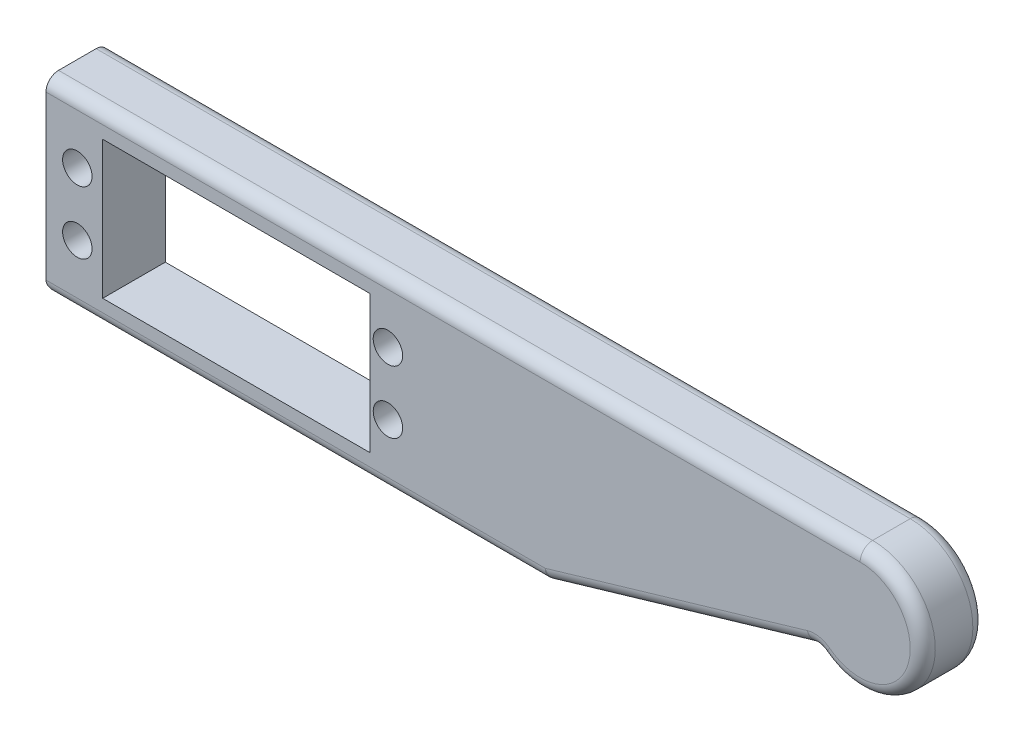
ISO-10303-21;
HEADER;
FILE_DESCRIPTION(('STEP AP214'),'2;1');
FILE_NAME('part.step','',(''),(''),'','','');
FILE_SCHEMA(('AUTOMOTIVE_DESIGN { 1 0 10303 214 1 1 1 1 }'));
ENDSEC;
DATA;
#1=APPLICATION_CONTEXT('core data for automotive mechanical design processes');
#2=APPLICATION_PROTOCOL_DEFINITION('international standard','automotive_design',2000,#1);
#3=PRODUCT_CONTEXT('',#1,'mechanical');
#4=PRODUCT('Part','Part','',(#3));
#5=PRODUCT_RELATED_PRODUCT_CATEGORY('part','',(#4));
#6=PRODUCT_DEFINITION_FORMATION('','',#4);
#7=PRODUCT_DEFINITION_CONTEXT('part definition',#1,'design');
#8=PRODUCT_DEFINITION('design','',#6,#7);
#9=PRODUCT_DEFINITION_SHAPE('','',#8);
#10=(LENGTH_UNIT() NAMED_UNIT(*) SI_UNIT(.MILLI.,.METRE.));
#11=(NAMED_UNIT(*) PLANE_ANGLE_UNIT() SI_UNIT($,.RADIAN.));
#12=(NAMED_UNIT(*) SI_UNIT($,.STERADIAN.) SOLID_ANGLE_UNIT());
#13=UNCERTAINTY_MEASURE_WITH_UNIT(LENGTH_MEASURE(1.E-05),#10,'distance_accuracy_value','');
#14=(GEOMETRIC_REPRESENTATION_CONTEXT(3) GLOBAL_UNCERTAINTY_ASSIGNED_CONTEXT((#13)) GLOBAL_UNIT_ASSIGNED_CONTEXT((#10,
#11,#12)) REPRESENTATION_CONTEXT('',''));
#15=CARTESIAN_POINT('',(0.,0.,0.));
#16=DIRECTION('',(0.,0.,1.));
#17=DIRECTION('',(1.,0.,0.));
#18=AXIS2_PLACEMENT_3D('',#15,#16,#17);
#19=CARTESIAN_POINT('',(60.,5.,10.));
#20=DIRECTION('',(0.,0.,1.));
#21=DIRECTION('',(1.,0.,0.));
#22=AXIS2_PLACEMENT_3D('',#19,#20,#21);
#23=PLANE('',#22);
#24=CARTESIAN_POINT('',(-15.4,-5.00000000000002,10.));
#25=DIRECTION('',(0.,0.,1.));
#26=DIRECTION('',(-1.,0.,0.));
#27=AXIS2_PLACEMENT_3D('',#24,#25,#26);
#28=CIRCLE('',#27,2.35);
#29=CARTESIAN_POINT('',(-17.75,-5.00000000000002,10.));
#30=VERTEX_POINT('',#29);
#31=EDGE_CURVE('E206',#30,#30,#28,.T.);
#32=ORIENTED_EDGE('',*,*,#31,.F.);
#33=EDGE_LOOP('',(#32));
#34=FACE_BOUND('',#33,.T.);
#35=CARTESIAN_POINT('',(-65.,5.00000000000001,10.));
#36=DIRECTION('',(0.,0.,1.));
#37=DIRECTION('',(1.,0.,0.));
#38=AXIS2_PLACEMENT_3D('',#35,#36,#37);
#39=CIRCLE('',#38,2.34999999999999);
#40=CARTESIAN_POINT('',(-62.65,5.00000000000001,10.));
#41=VERTEX_POINT('',#40);
#42=EDGE_CURVE('E217',#41,#41,#39,.T.);
#43=ORIENTED_EDGE('',*,*,#42,.F.);
#44=EDGE_LOOP('',(#43));
#45=FACE_BOUND('',#44,.T.);
#46=CARTESIAN_POINT('',(60.,5.,10.));
#47=DIRECTION('',(0.,0.,1.));
#48=DIRECTION('',(1.,0.,0.));
#49=AXIS2_PLACEMENT_3D('',#46,#47,#48);
#50=CIRCLE('',#49,8.00000000000001);
#51=CARTESIAN_POINT('',(55.1371863446756,-1.35240453321343,10.));
#52=VERTEX_POINT('',#51);
#53=CARTESIAN_POINT('',(60.,13.,10.));
#54=VERTEX_POINT('',#53);
#55=EDGE_CURVE('E244',#52,#54,#50,.T.);
#56=ORIENTED_EDGE('',*,*,#55,.T.);
#57=DIRECTION('',(-1.,0.,0.));
#58=VECTOR('',#57,1.);
#59=CARTESIAN_POINT('',(-70.,13.,10.));
#60=LINE('',#59,#58);
#61=CARTESIAN_POINT('',(-70.,13.,10.));
#62=VERTEX_POINT('',#61);
#63=EDGE_CURVE('E241',#54,#62,#60,.T.);
#64=ORIENTED_EDGE('',*,*,#63,.T.);
#65=DIRECTION('',(0.,-1.,0.));
#66=VECTOR('',#65,1.);
#67=CARTESIAN_POINT('',(-70.,15.,10.));
#68=LINE('',#67,#66);
#69=CARTESIAN_POINT('',(-70.,-13.,10.));
#70=VERTEX_POINT('',#69);
#71=EDGE_CURVE('E221',#62,#70,#68,.T.);
#72=ORIENTED_EDGE('',*,*,#71,.T.);
#73=DIRECTION('',(1.,0.,0.));
#74=VECTOR('',#73,1.);
#75=CARTESIAN_POINT('',(9.99999999999999,-13.,10.));
#76=LINE('',#75,#74);
#77=CARTESIAN_POINT('',(9.71208045693147,-13.,10.));
#78=VERTEX_POINT('',#77);
#79=EDGE_CURVE('E233',#70,#78,#76,.T.);
#80=ORIENTED_EDGE('',*,*,#79,.T.);
#81=DIRECTION('',(0.959392730302152,0.282073729800176,0.));
#82=VECTOR('',#81,1.);
#83=CARTESIAN_POINT('',(52.6085254039965,-0.387896698387758,10.));
#84=LINE('',#83,#82);
#85=CARTESIAN_POINT('',(51.5774845978127,-0.691035878611532,10.));
#86=VERTEX_POINT('',#85);
#87=EDGE_CURVE('E240',#78,#86,#84,.T.);
#88=ORIENTED_EDGE('',*,*,#87,.T.);
#89=CARTESIAN_POINT('',(52.7057795170134,-4.52860679982014,10.));
#90=DIRECTION('',(0.,0.,1.));
#91=DIRECTION('',(1.,0.,0.));
#92=AXIS2_PLACEMENT_3D('',#89,#90,#91);
#93=CIRCLE('',#92,4.);
#94=EDGE_CURVE('E239',#52,#86,#93,.T.);
#95=ORIENTED_EDGE('',*,*,#94,.F.);
#96=EDGE_LOOP('',(#56,#64,#72,#80,#88,#95));
#97=FACE_BOUND('',#96,.T.);
#98=CARTESIAN_POINT('',(-15.4,5.00000000000002,10.));
#99=DIRECTION('',(0.,0.,1.));
#100=DIRECTION('',(1.,0.,0.));
#101=AXIS2_PLACEMENT_3D('',#98,#99,#100);
#102=CIRCLE('',#101,2.35);
#103=CARTESIAN_POINT('',(-13.05,5.00000000000002,10.));
#104=VERTEX_POINT('',#103);
#105=EDGE_CURVE('E215',#104,#104,#102,.T.);
#106=ORIENTED_EDGE('',*,*,#105,.F.);
#107=EDGE_LOOP('',(#106));
#108=FACE_BOUND('',#107,.T.);
#109=CARTESIAN_POINT('',(-65.,-4.99999999999999,10.));
#110=DIRECTION('',(0.,0.,1.));
#111=DIRECTION('',(-1.,0.,0.));
#112=AXIS2_PLACEMENT_3D('',#109,#110,#111);
#113=CIRCLE('',#112,2.34999999999999);
#114=CARTESIAN_POINT('',(-67.35,-4.99999999999999,10.));
#115=VERTEX_POINT('',#114);
#116=EDGE_CURVE('E199',#115,#115,#113,.T.);
#117=ORIENTED_EDGE('',*,*,#116,.F.);
#118=EDGE_LOOP('',(#117));
#119=FACE_BOUND('',#118,.T.);
#120=DIRECTION('',(-1.,0.,0.));
#121=VECTOR('',#120,1.);
#122=CARTESIAN_POINT('',(-60.95,11.,10.));
#123=LINE('',#122,#121);
#124=CARTESIAN_POINT('',(-18.2952994616207,11.,10.));
#125=VERTEX_POINT('',#124);
#126=CARTESIAN_POINT('',(-60.95,11.,10.));
#127=VERTEX_POINT('',#126);
#128=EDGE_CURVE('E60',#125,#127,#123,.T.);
#129=ORIENTED_EDGE('',*,*,#128,.F.);
#130=DIRECTION('',(0.,-1.,0.));
#131=VECTOR('',#130,1.);
#132=CARTESIAN_POINT('',(-18.2952994616207,4.99999999999998,10.));
#133=LINE('',#132,#131);
#134=CARTESIAN_POINT('',(-18.2952994616207,-11.,10.));
#135=VERTEX_POINT('',#134);
#136=EDGE_CURVE('E338',#125,#135,#133,.T.);
#137=ORIENTED_EDGE('',*,*,#136,.T.);
#138=DIRECTION('',(1.,0.,0.));
#139=VECTOR('',#138,1.);
#140=CARTESIAN_POINT('',(-60.95,-11.,10.));
#141=LINE('',#140,#139);
#142=CARTESIAN_POINT('',(-60.95,-11.,10.));
#143=VERTEX_POINT('',#142);
#144=EDGE_CURVE('E61',#143,#135,#141,.T.);
#145=ORIENTED_EDGE('',*,*,#144,.F.);
#146=DIRECTION('',(0.,-1.,0.));
#147=VECTOR('',#146,1.);
#148=CARTESIAN_POINT('',(-60.95,11.,10.));
#149=LINE('',#148,#147);
#150=EDGE_CURVE('E172',#127,#143,#149,.T.);
#151=ORIENTED_EDGE('',*,*,#150,.F.);
#152=EDGE_LOOP('',(#129,#137,#145,#151));
#153=FACE_BOUND('',#152,.T.);
#154=ADVANCED_FACE('F41',(#34,#45,#97,#108,#119,#153),#23,.T.);
#155=CARTESIAN_POINT('',(60.,5.,0.));
#156=DIRECTION('',(0.,0.,1.));
#157=DIRECTION('',(1.,0.,0.));
#158=AXIS2_PLACEMENT_3D('',#155,#156,#157);
#159=PLANE('',#158);
#160=CARTESIAN_POINT('',(-65.,-4.99999999999999,0.));
#161=DIRECTION('',(0.,0.,1.));
#162=DIRECTION('',(-1.,0.,0.));
#163=AXIS2_PLACEMENT_3D('',#160,#161,#162);
#164=CIRCLE('',#163,2.34999999999999);
#165=CARTESIAN_POINT('',(-67.35,-4.99999999999999,0.));
#166=VERTEX_POINT('',#165);
#167=EDGE_CURVE('E200',#166,#166,#164,.T.);
#168=ORIENTED_EDGE('',*,*,#167,.T.);
#169=EDGE_LOOP('',(#168));
#170=FACE_BOUND('',#169,.T.);
#171=CARTESIAN_POINT('',(-15.4,-5.00000000000002,0.));
#172=DIRECTION('',(0.,0.,1.));
#173=DIRECTION('',(-1.,0.,0.));
#174=AXIS2_PLACEMENT_3D('',#171,#172,#173);
#175=CIRCLE('',#174,2.35);
#176=CARTESIAN_POINT('',(-17.75,-5.00000000000002,0.));
#177=VERTEX_POINT('',#176);
#178=EDGE_CURVE('E201',#177,#177,#175,.T.);
#179=ORIENTED_EDGE('',*,*,#178,.T.);
#180=EDGE_LOOP('',(#179));
#181=FACE_BOUND('',#180,.T.);
#182=CARTESIAN_POINT('',(-15.4,5.00000000000002,0.));
#183=DIRECTION('',(0.,0.,1.));
#184=DIRECTION('',(1.,0.,0.));
#185=AXIS2_PLACEMENT_3D('',#182,#183,#184);
#186=CIRCLE('',#185,2.35);
#187=CARTESIAN_POINT('',(-13.05,5.00000000000002,0.));
#188=VERTEX_POINT('',#187);
#189=EDGE_CURVE('E207',#188,#188,#186,.T.);
#190=ORIENTED_EDGE('',*,*,#189,.T.);
#191=EDGE_LOOP('',(#190));
#192=FACE_BOUND('',#191,.T.);
#193=CARTESIAN_POINT('',(-65.,5.00000000000001,0.));
#194=DIRECTION('',(0.,0.,1.));
#195=DIRECTION('',(1.,0.,0.));
#196=AXIS2_PLACEMENT_3D('',#193,#194,#195);
#197=CIRCLE('',#196,2.34999999999999);
#198=CARTESIAN_POINT('',(-62.65,5.00000000000001,0.));
#199=VERTEX_POINT('',#198);
#200=EDGE_CURVE('E214',#199,#199,#197,.T.);
#201=ORIENTED_EDGE('',*,*,#200,.T.);
#202=EDGE_LOOP('',(#201));
#203=FACE_BOUND('',#202,.T.);
#204=DIRECTION('',(0.,-1.,0.));
#205=VECTOR('',#204,1.);
#206=CARTESIAN_POINT('',(-70.,15.,0.));
#207=LINE('',#206,#205);
#208=CARTESIAN_POINT('',(-70.,13.,0.));
#209=VERTEX_POINT('',#208);
#210=CARTESIAN_POINT('',(-70.,-13.,0.));
#211=VERTEX_POINT('',#210);
#212=EDGE_CURVE('E222',#209,#211,#207,.T.);
#213=ORIENTED_EDGE('',*,*,#212,.F.);
#214=DIRECTION('',(-1.,0.,0.));
#215=VECTOR('',#214,1.);
#216=CARTESIAN_POINT('',(60.,13.,0.));
#217=LINE('',#216,#215);
#218=CARTESIAN_POINT('',(60.,13.,0.));
#219=VERTEX_POINT('',#218);
#220=EDGE_CURVE('E266',#209,#219,#217,.F.);
#221=ORIENTED_EDGE('',*,*,#220,.T.);
#222=CARTESIAN_POINT('',(60.,5.,0.));
#223=DIRECTION('',(0.,0.,1.));
#224=DIRECTION('',(1.,0.,0.));
#225=AXIS2_PLACEMENT_3D('',#222,#223,#224);
#226=CIRCLE('',#225,8.00000000000001);
#227=CARTESIAN_POINT('',(55.1371863446756,-1.35240453321343,0.));
#228=VERTEX_POINT('',#227);
#229=EDGE_CURVE('E262',#219,#228,#226,.F.);
#230=ORIENTED_EDGE('',*,*,#229,.T.);
#231=CARTESIAN_POINT('',(52.7057795170134,-4.52860679982014,0.));
#232=DIRECTION('',(0.,0.,1.));
#233=DIRECTION('',(1.,0.,0.));
#234=AXIS2_PLACEMENT_3D('',#231,#232,#233);
#235=CIRCLE('',#234,4.);
#236=CARTESIAN_POINT('',(51.5774845978127,-0.691035878611534,0.));
#237=VERTEX_POINT('',#236);
#238=EDGE_CURVE('E261',#237,#228,#235,.F.);
#239=ORIENTED_EDGE('',*,*,#238,.F.);
#240=DIRECTION('',(0.959392730302152,0.282073729800176,0.));
#241=VECTOR('',#240,1.);
#242=CARTESIAN_POINT('',(60.8699628038205,2.0410715304471,0.));
#243=LINE('',#242,#241);
#244=CARTESIAN_POINT('',(9.71208045693148,-13.,0.));
#245=VERTEX_POINT('',#244);
#246=EDGE_CURVE('E259',#237,#245,#243,.F.);
#247=ORIENTED_EDGE('',*,*,#246,.T.);
#248=DIRECTION('',(1.,0.,0.));
#249=VECTOR('',#248,1.);
#250=CARTESIAN_POINT('',(60.,-13.,0.));
#251=LINE('',#250,#249);
#252=EDGE_CURVE('E260',#245,#211,#251,.F.);
#253=ORIENTED_EDGE('',*,*,#252,.T.);
#254=EDGE_LOOP('',(#213,#221,#230,#239,#247,#253));
#255=FACE_BOUND('',#254,.T.);
#256=DIRECTION('',(0.,1.,0.));
#257=VECTOR('',#256,1.);
#258=CARTESIAN_POINT('',(-19.45,11.,0.));
#259=LINE('',#258,#257);
#260=CARTESIAN_POINT('',(-19.45,-11.,0.));
#261=VERTEX_POINT('',#260);
#262=CARTESIAN_POINT('',(-19.45,11.,0.));
#263=VERTEX_POINT('',#262);
#264=EDGE_CURVE('E189',#261,#263,#259,.T.);
#265=ORIENTED_EDGE('',*,*,#264,.T.);
#266=DIRECTION('',(-1.,0.,0.));
#267=VECTOR('',#266,1.);
#268=CARTESIAN_POINT('',(-60.95,11.,0.));
#269=LINE('',#268,#267);
#270=CARTESIAN_POINT('',(-60.95,11.,0.));
#271=VERTEX_POINT('',#270);
#272=EDGE_CURVE('E188',#263,#271,#269,.T.);
#273=ORIENTED_EDGE('',*,*,#272,.T.);
#274=DIRECTION('',(0.,-1.,0.));
#275=VECTOR('',#274,1.);
#276=CARTESIAN_POINT('',(-60.95,11.,0.));
#277=LINE('',#276,#275);
#278=CARTESIAN_POINT('',(-60.95,-11.,0.));
#279=VERTEX_POINT('',#278);
#280=EDGE_CURVE('E180',#271,#279,#277,.T.);
#281=ORIENTED_EDGE('',*,*,#280,.T.);
#282=DIRECTION('',(1.,0.,0.));
#283=VECTOR('',#282,1.);
#284=CARTESIAN_POINT('',(-60.95,-11.,0.));
#285=LINE('',#284,#283);
#286=EDGE_CURVE('E174',#279,#261,#285,.T.);
#287=ORIENTED_EDGE('',*,*,#286,.T.);
#288=EDGE_LOOP('',(#265,#273,#281,#287));
#289=FACE_BOUND('',#288,.T.);
#290=ADVANCED_FACE('F352',(#170,#181,#192,#203,#255,#289),#159,.F.);
#291=CARTESIAN_POINT('',(-70.,15.,10.));
#292=DIRECTION('',(1.,0.,0.));
#293=DIRECTION('',(0.,0.,-1.));
#294=AXIS2_PLACEMENT_3D('',#291,#292,#293);
#295=PLANE('',#294);
#296=ORIENTED_EDGE('',*,*,#71,.F.);
#297=CARTESIAN_POINT('',(-70.,13.,8.));
#298=DIRECTION('',(1.,0.,0.));
#299=DIRECTION('',(0.,0.,-1.));
#300=AXIS2_PLACEMENT_3D('',#297,#298,#299);
#301=CIRCLE('',#300,2.);
#302=CARTESIAN_POINT('',(-70.,15.,8.));
#303=VERTEX_POINT('',#302);
#304=EDGE_CURVE('E253',#62,#303,#301,.F.);
#305=ORIENTED_EDGE('',*,*,#304,.T.);
#306=DIRECTION('',(0.,0.,-1.));
#307=VECTOR('',#306,1.);
#308=CARTESIAN_POINT('',(-70.,15.,10.));
#309=LINE('',#308,#307);
#310=CARTESIAN_POINT('',(-70.,15.,2.));
#311=VERTEX_POINT('',#310);
#312=EDGE_CURVE('E229',#303,#311,#309,.T.);
#313=ORIENTED_EDGE('',*,*,#312,.T.);
#314=CARTESIAN_POINT('',(-70.,13.,2.));
#315=DIRECTION('',(1.,0.,0.));
#316=DIRECTION('',(0.,0.,-1.));
#317=AXIS2_PLACEMENT_3D('',#314,#315,#316);
#318=CIRCLE('',#317,2.);
#319=EDGE_CURVE('E246',#311,#209,#318,.F.);
#320=ORIENTED_EDGE('',*,*,#319,.T.);
#321=ORIENTED_EDGE('',*,*,#212,.T.);
#322=DIRECTION('',(0.,0.,-1.));
#323=VECTOR('',#322,1.);
#324=CARTESIAN_POINT('',(-70.,-13.,10.));
#325=LINE('',#324,#323);
#326=EDGE_CURVE('E249',#211,#70,#325,.F.);
#327=ORIENTED_EDGE('',*,*,#326,.T.);
#328=EDGE_LOOP('',(#296,#305,#313,#320,#321,#327));
#329=FACE_BOUND('',#328,.T.);
#330=ADVANCED_FACE('F355',(#329),#295,.F.);
#331=CARTESIAN_POINT('',(-70.,-15.,10.));
#332=DIRECTION('',(0.,1.,0.));
#333=DIRECTION('',(0.,0.,1.));
#334=AXIS2_PLACEMENT_3D('',#331,#332,#333);
#335=PLANE('',#334);
#336=DIRECTION('',(1.,0.,0.));
#337=VECTOR('',#336,1.);
#338=CARTESIAN_POINT('',(-70.,-15.,8.));
#339=LINE('',#338,#337);
#340=CARTESIAN_POINT('',(9.71208045693148,-15.,8.));
#341=VERTEX_POINT('',#340);
#342=CARTESIAN_POINT('',(-68.,-15.,8.));
#343=VERTEX_POINT('',#342);
#344=EDGE_CURVE('E289',#341,#343,#339,.F.);
#345=ORIENTED_EDGE('',*,*,#344,.T.);
#346=DIRECTION('',(0.,0.,-1.));
#347=VECTOR('',#346,1.);
#348=CARTESIAN_POINT('',(-68.,-15.,10.));
#349=LINE('',#348,#347);
#350=CARTESIAN_POINT('',(-68.,-15.,2.));
#351=VERTEX_POINT('',#350);
#352=EDGE_CURVE('E286',#343,#351,#349,.T.);
#353=ORIENTED_EDGE('',*,*,#352,.T.);
#354=DIRECTION('',(1.,0.,0.));
#355=VECTOR('',#354,1.);
#356=CARTESIAN_POINT('',(-70.,-15.,2.));
#357=LINE('',#356,#355);
#358=CARTESIAN_POINT('',(9.71208045693148,-15.,2.));
#359=VERTEX_POINT('',#358);
#360=EDGE_CURVE('E285',#351,#359,#357,.T.);
#361=ORIENTED_EDGE('',*,*,#360,.T.);
#362=DIRECTION('',(0.,0.,-1.));
#363=VECTOR('',#362,1.);
#364=CARTESIAN_POINT('',(9.71208045693148,-15.,10.));
#365=LINE('',#364,#363);
#366=EDGE_CURVE('E283',#359,#341,#365,.F.);
#367=ORIENTED_EDGE('',*,*,#366,.T.);
#368=EDGE_LOOP('',(#345,#353,#361,#367));
#369=FACE_BOUND('',#368,.T.);
#370=ADVANCED_FACE('F358',(#369),#335,.F.);
#371=CARTESIAN_POINT('',(9.99999999999999,-15.,10.));
#372=DIRECTION('',(-0.282073729800176,0.959392730302152,0.));
#373=DIRECTION('',(-0.959392730302152,-0.282073729800176,0.));
#374=AXIS2_PLACEMENT_3D('',#371,#372,#373);
#375=PLANE('',#374);
#376=DIRECTION('',(0.,0.,1.));
#377=VECTOR('',#376,1.);
#378=CARTESIAN_POINT('',(52.141632057413,-2.60982133921584,10.));
#379=LINE('',#378,#377);
#380=CARTESIAN_POINT('',(52.141632057413,-2.60982133921584,2.));
#381=VERTEX_POINT('',#380);
#382=CARTESIAN_POINT('',(52.141632057413,-2.60982133921584,8.));
#383=VERTEX_POINT('',#382);
#384=EDGE_CURVE('E279',#381,#383,#379,.T.);
#385=ORIENTED_EDGE('',*,*,#384,.T.);
#386=DIRECTION('',(0.959392730302152,0.282073729800176,0.));
#387=VECTOR('',#386,1.);
#388=CARTESIAN_POINT('',(9.99999999999999,-15.,8.));
#389=LINE('',#388,#387);
#390=CARTESIAN_POINT('',(10.2762279165318,-14.9187854606043,8.));
#391=VERTEX_POINT('',#390);
#392=EDGE_CURVE('E278',#383,#391,#389,.F.);
#393=ORIENTED_EDGE('',*,*,#392,.T.);
#394=DIRECTION('',(0.,0.,-1.));
#395=VECTOR('',#394,1.);
#396=CARTESIAN_POINT('',(10.2762279165318,-14.9187854606043,10.));
#397=LINE('',#396,#395);
#398=CARTESIAN_POINT('',(10.2762279165318,-14.9187854606043,2.));
#399=VERTEX_POINT('',#398);
#400=EDGE_CURVE('E273',#391,#399,#397,.T.);
#401=ORIENTED_EDGE('',*,*,#400,.T.);
#402=DIRECTION('',(0.959392730302152,0.282073729800176,0.));
#403=VECTOR('',#402,1.);
#404=CARTESIAN_POINT('',(9.99999999999999,-15.,2.));
#405=LINE('',#404,#403);
#406=EDGE_CURVE('E277',#399,#381,#405,.T.);
#407=ORIENTED_EDGE('',*,*,#406,.T.);
#408=EDGE_LOOP('',(#385,#393,#401,#407));
#409=FACE_BOUND('',#408,.T.);
#410=ADVANCED_FACE('F380',(#409),#375,.F.);
#411=CARTESIAN_POINT('',(60.,5.,10.));
#412=DIRECTION('',(0.,0.,-1.));
#413=DIRECTION('',(-1.,0.,0.));
#414=AXIS2_PLACEMENT_3D('',#411,#412,#413);
#415=CYLINDRICAL_SURFACE('',#414,10.);
#416=DIRECTION('',(0.,0.,-1.));
#417=VECTOR('',#416,1.);
#418=CARTESIAN_POINT('',(60.,15.,10.));
#419=LINE('',#418,#417);
#420=CARTESIAN_POINT('',(60.,15.,8.));
#421=VERTEX_POINT('',#420);
#422=CARTESIAN_POINT('',(60.,15.,2.));
#423=VERTEX_POINT('',#422);
#424=EDGE_CURVE('E234',#421,#423,#419,.T.);
#425=ORIENTED_EDGE('',*,*,#424,.F.);
#426=CARTESIAN_POINT('',(60.,5.,8.));
#427=DIRECTION('',(0.,0.,1.));
#428=DIRECTION('',(1.,0.,0.));
#429=AXIS2_PLACEMENT_3D('',#426,#427,#428);
#430=CIRCLE('',#429,10.);
#431=CARTESIAN_POINT('',(53.9214829308445,-2.94050566651679,8.));
#432=VERTEX_POINT('',#431);
#433=EDGE_CURVE('E275',#421,#432,#430,.F.);
#434=ORIENTED_EDGE('',*,*,#433,.T.);
#435=DIRECTION('',(0.,0.,-1.));
#436=VECTOR('',#435,1.);
#437=CARTESIAN_POINT('',(53.9214829308445,-2.94050566651679,10.));
#438=LINE('',#437,#436);
#439=CARTESIAN_POINT('',(53.9214829308445,-2.94050566651679,2.));
#440=VERTEX_POINT('',#439);
#441=EDGE_CURVE('E268',#432,#440,#438,.T.);
#442=ORIENTED_EDGE('',*,*,#441,.T.);
#443=CARTESIAN_POINT('',(60.,5.,2.));
#444=DIRECTION('',(0.,0.,1.));
#445=DIRECTION('',(1.,0.,0.));
#446=AXIS2_PLACEMENT_3D('',#443,#444,#445);
#447=CIRCLE('',#446,10.);
#448=EDGE_CURVE('E269',#440,#423,#447,.T.);
#449=ORIENTED_EDGE('',*,*,#448,.T.);
#450=EDGE_LOOP('',(#425,#434,#442,#449));
#451=FACE_BOUND('',#450,.T.);
#452=ADVANCED_FACE('F373',(#451),#415,.T.);
#453=CARTESIAN_POINT('',(-70.,15.,10.));
#454=DIRECTION('',(0.,-1.,0.));
#455=DIRECTION('',(1.,0.,0.));
#456=AXIS2_PLACEMENT_3D('',#453,#454,#455);
#457=PLANE('',#456);
#458=ORIENTED_EDGE('',*,*,#312,.F.);
#459=DIRECTION('',(-1.,0.,0.));
#460=VECTOR('',#459,1.);
#461=CARTESIAN_POINT('',(60.,15.,8.));
#462=LINE('',#461,#460);
#463=EDGE_CURVE('E254',#303,#421,#462,.F.);
#464=ORIENTED_EDGE('',*,*,#463,.T.);
#465=ORIENTED_EDGE('',*,*,#424,.T.);
#466=DIRECTION('',(-1.,0.,0.));
#467=VECTOR('',#466,1.);
#468=CARTESIAN_POINT('',(-70.,15.,2.));
#469=LINE('',#468,#467);
#470=EDGE_CURVE('E251',#423,#311,#469,.T.);
#471=ORIENTED_EDGE('',*,*,#470,.T.);
#472=EDGE_LOOP('',(#458,#464,#465,#471));
#473=FACE_BOUND('',#472,.T.);
#474=ADVANCED_FACE('F369',(#473),#457,.F.);
#475=CARTESIAN_POINT('',(-65.,5.00000000000001,10.));
#476=DIRECTION('',(0.,0.,-1.));
#477=DIRECTION('',(-1.,0.,0.));
#478=AXIS2_PLACEMENT_3D('',#475,#476,#477);
#479=CYLINDRICAL_SURFACE('',#478,2.34999999999999);
#480=ORIENTED_EDGE('',*,*,#42,.T.);
#481=EDGE_LOOP('',(#480));
#482=FACE_BOUND('',#481,.T.);
#483=ORIENTED_EDGE('',*,*,#200,.F.);
#484=EDGE_LOOP('',(#483));
#485=FACE_BOUND('',#484,.T.);
#486=ADVANCED_FACE('F375',(#482,#485),#479,.F.);
#487=CARTESIAN_POINT('',(-15.4,5.00000000000002,10.));
#488=DIRECTION('',(0.,0.,-1.));
#489=DIRECTION('',(-1.,0.,0.));
#490=AXIS2_PLACEMENT_3D('',#487,#488,#489);
#491=CYLINDRICAL_SURFACE('',#490,2.35);
#492=ORIENTED_EDGE('',*,*,#105,.T.);
#493=EDGE_LOOP('',(#492));
#494=FACE_BOUND('',#493,.T.);
#495=ORIENTED_EDGE('',*,*,#189,.F.);
#496=EDGE_LOOP('',(#495));
#497=FACE_BOUND('',#496,.T.);
#498=ADVANCED_FACE('F510',(#494,#497),#491,.F.);
#499=CARTESIAN_POINT('',(-15.4,-5.00000000000002,10.));
#500=DIRECTION('',(0.,0.,-1.));
#501=DIRECTION('',(-1.,0.,0.));
#502=AXIS2_PLACEMENT_3D('',#499,#500,#501);
#503=CYLINDRICAL_SURFACE('',#502,2.35);
#504=ORIENTED_EDGE('',*,*,#31,.T.);
#505=EDGE_LOOP('',(#504));
#506=FACE_BOUND('',#505,.T.);
#507=ORIENTED_EDGE('',*,*,#178,.F.);
#508=EDGE_LOOP('',(#507));
#509=FACE_BOUND('',#508,.T.);
#510=ADVANCED_FACE('F498',(#506,#509),#503,.F.);
#511=CARTESIAN_POINT('',(-65.,-4.99999999999999,10.));
#512=DIRECTION('',(0.,0.,-1.));
#513=DIRECTION('',(-1.,0.,0.));
#514=AXIS2_PLACEMENT_3D('',#511,#512,#513);
#515=CYLINDRICAL_SURFACE('',#514,2.34999999999999);
#516=ORIENTED_EDGE('',*,*,#116,.T.);
#517=EDGE_LOOP('',(#516));
#518=FACE_BOUND('',#517,.T.);
#519=ORIENTED_EDGE('',*,*,#167,.F.);
#520=EDGE_LOOP('',(#519));
#521=FACE_BOUND('',#520,.T.);
#522=ADVANCED_FACE('F500',(#518,#521),#515,.F.);
#523=CARTESIAN_POINT('',(-19.45,11.,10.));
#524=DIRECTION('',(-1.,0.,0.));
#525=DIRECTION('',(0.,-1.,0.));
#526=AXIS2_PLACEMENT_3D('',#523,#524,#525);
#527=PLANE('',#526);
#528=DIRECTION('',(0.,0.,-1.));
#529=VECTOR('',#528,1.);
#530=CARTESIAN_POINT('',(-19.45,-11.,10.));
#531=LINE('',#530,#529);
#532=CARTESIAN_POINT('',(-19.45,-11.,7.99999999999998));
#533=VERTEX_POINT('',#532);
#534=EDGE_CURVE('E184',#533,#261,#531,.T.);
#535=ORIENTED_EDGE('',*,*,#534,.F.);
#536=DIRECTION('',(0.,1.,0.));
#537=VECTOR('',#536,1.);
#538=CARTESIAN_POINT('',(-19.45,11.,7.99999999999998));
#539=LINE('',#538,#537);
#540=CARTESIAN_POINT('',(-19.45,11.,7.99999999999998));
#541=VERTEX_POINT('',#540);
#542=EDGE_CURVE('E295',#533,#541,#539,.T.);
#543=ORIENTED_EDGE('',*,*,#542,.T.);
#544=DIRECTION('',(0.,0.,-1.));
#545=VECTOR('',#544,1.);
#546=CARTESIAN_POINT('',(-19.45,11.,10.));
#547=LINE('',#546,#545);
#548=EDGE_CURVE('E178',#541,#263,#547,.T.);
#549=ORIENTED_EDGE('',*,*,#548,.T.);
#550=ORIENTED_EDGE('',*,*,#264,.F.);
#551=EDGE_LOOP('',(#535,#543,#549,#550));
#552=FACE_BOUND('',#551,.T.);
#553=ADVANCED_FACE('F349',(#552),#527,.T.);
#554=CARTESIAN_POINT('',(-60.95,11.,10.));
#555=DIRECTION('',(0.,-1.,0.));
#556=DIRECTION('',(0.,0.,-1.));
#557=AXIS2_PLACEMENT_3D('',#554,#555,#556);
#558=PLANE('',#557);
#559=ORIENTED_EDGE('',*,*,#272,.F.);
#560=ORIENTED_EDGE('',*,*,#548,.F.);
#561=DIRECTION('',(-0.499999999999998,0.,-0.86602540378444));
#562=VECTOR('',#561,1.);
#563=CARTESIAN_POINT('',(-19.45,11.,7.99999999999998));
#564=LINE('',#563,#562);
#565=EDGE_CURVE('E49',#541,#125,#564,.F.);
#566=ORIENTED_EDGE('',*,*,#565,.T.);
#567=ORIENTED_EDGE('',*,*,#128,.T.);
#568=DIRECTION('',(0.,0.,-1.));
#569=VECTOR('',#568,1.);
#570=CARTESIAN_POINT('',(-60.95,11.,10.));
#571=LINE('',#570,#569);
#572=EDGE_CURVE('E170',#127,#271,#571,.T.);
#573=ORIENTED_EDGE('',*,*,#572,.T.);
#574=EDGE_LOOP('',(#559,#560,#566,#567,#573));
#575=FACE_BOUND('',#574,.T.);
#576=ADVANCED_FACE('F167',(#575),#558,.T.);
#577=CARTESIAN_POINT('',(-60.95,11.,10.));
#578=DIRECTION('',(1.,0.,0.));
#579=DIRECTION('',(0.,1.,0.));
#580=AXIS2_PLACEMENT_3D('',#577,#578,#579);
#581=PLANE('',#580);
#582=ORIENTED_EDGE('',*,*,#280,.F.);
#583=ORIENTED_EDGE('',*,*,#572,.F.);
#584=ORIENTED_EDGE('',*,*,#150,.T.);
#585=DIRECTION('',(0.,0.,-1.));
#586=VECTOR('',#585,1.);
#587=CARTESIAN_POINT('',(-60.95,-11.,10.));
#588=LINE('',#587,#586);
#589=EDGE_CURVE('E182',#143,#279,#588,.T.);
#590=ORIENTED_EDGE('',*,*,#589,.T.);
#591=EDGE_LOOP('',(#582,#583,#584,#590));
#592=FACE_BOUND('',#591,.T.);
#593=ADVANCED_FACE('F177',(#592),#581,.T.);
#594=CARTESIAN_POINT('',(-60.95,-11.,10.));
#595=DIRECTION('',(0.,1.,0.));
#596=DIRECTION('',(0.,0.,1.));
#597=AXIS2_PLACEMENT_3D('',#594,#595,#596);
#598=PLANE('',#597);
#599=ORIENTED_EDGE('',*,*,#286,.F.);
#600=ORIENTED_EDGE('',*,*,#589,.F.);
#601=ORIENTED_EDGE('',*,*,#144,.T.);
#602=DIRECTION('',(0.499999999999998,0.,0.86602540378444));
#603=VECTOR('',#602,1.);
#604=CARTESIAN_POINT('',(-19.45,-11.,7.99999999999998));
#605=LINE('',#604,#603);
#606=EDGE_CURVE('E11',#135,#533,#605,.F.);
#607=ORIENTED_EDGE('',*,*,#606,.T.);
#608=ORIENTED_EDGE('',*,*,#534,.T.);
#609=EDGE_LOOP('',(#599,#600,#601,#607,#608));
#610=FACE_BOUND('',#609,.T.);
#611=ADVANCED_FACE('F347',(#610),#598,.T.);
#612=CARTESIAN_POINT('',(-70.,-13.,2.));
#613=DIRECTION('',(1.,0.,0.));
#614=DIRECTION('',(0.,0.,-1.));
#615=AXIS2_PLACEMENT_3D('',#612,#613,#614);
#616=CYLINDRICAL_SURFACE('',#615,2.);
#617=CARTESIAN_POINT('',(-68.,-13.,2.));
#618=DIRECTION('',(0.707106781186547,0.,-0.707106781186547));
#619=DIRECTION('',(0.707106781186547,0.,0.707106781186547));
#620=AXIS2_PLACEMENT_3D('',#617,#618,#619);
#621=ELLIPSE('',#620,2.82842712474619,2.);
#622=EDGE_CURVE('E331',#211,#351,#621,.F.);
#623=ORIENTED_EDGE('',*,*,#622,.F.);
#624=ORIENTED_EDGE('',*,*,#252,.F.);
#625=CARTESIAN_POINT('',(9.71208045693148,-13.,2.));
#626=DIRECTION('',(1.,0.,0.));
#627=DIRECTION('',(0.,0.,-1.));
#628=AXIS2_PLACEMENT_3D('',#625,#626,#627);
#629=CIRCLE('',#628,2.);
#630=EDGE_CURVE('E192',#359,#245,#629,.T.);
#631=ORIENTED_EDGE('',*,*,#630,.F.);
#632=ORIENTED_EDGE('',*,*,#360,.F.);
#633=EDGE_LOOP('',(#623,#624,#631,#632));
#634=FACE_BOUND('',#633,.T.);
#635=ADVANCED_FACE('F438',(#634),#616,.T.);
#636=CARTESIAN_POINT('',(-70.,13.,2.));
#637=DIRECTION('',(-1.,0.,0.));
#638=DIRECTION('',(0.,-1.,0.));
#639=AXIS2_PLACEMENT_3D('',#636,#637,#638);
#640=CYLINDRICAL_SURFACE('',#639,2.);
#641=ORIENTED_EDGE('',*,*,#319,.F.);
#642=ORIENTED_EDGE('',*,*,#470,.F.);
#643=CARTESIAN_POINT('',(60.,13.,2.));
#644=DIRECTION('',(1.,0.,0.));
#645=DIRECTION('',(0.,0.,-1.));
#646=AXIS2_PLACEMENT_3D('',#643,#644,#645);
#647=CIRCLE('',#646,2.);
#648=EDGE_CURVE('E332',#219,#423,#647,.T.);
#649=ORIENTED_EDGE('',*,*,#648,.F.);
#650=ORIENTED_EDGE('',*,*,#220,.F.);
#651=EDGE_LOOP('',(#641,#642,#649,#650));
#652=FACE_BOUND('',#651,.T.);
#653=ADVANCED_FACE('F436',(#652),#640,.T.);
#654=CARTESIAN_POINT('',(9.71208045693148,-13.,2.));
#655=DIRECTION('',(0.,0.,-1.));
#656=DIRECTION('',(-1.,0.,0.));
#657=AXIS2_PLACEMENT_3D('',#654,#655,#656);
#658=SPHERICAL_SURFACE('',#657,2.);
#659=CARTESIAN_POINT('',(9.71208045693148,-13.,2.));
#660=DIRECTION('',(0.,0.,-1.));
#661=DIRECTION('',(-1.,0.,0.));
#662=AXIS2_PLACEMENT_3D('',#659,#660,#661);
#663=CIRCLE('',#662,2.);
#664=EDGE_CURVE('E324',#359,#399,#663,.F.);
#665=ORIENTED_EDGE('',*,*,#664,.F.);
#666=ORIENTED_EDGE('',*,*,#630,.T.);
#667=CARTESIAN_POINT('',(9.71208045693148,-13.,2.));
#668=DIRECTION('',(-0.959392730302152,-0.282073729800177,0.));
#669=DIRECTION('',(0.282073729800177,-0.959392730302152,0.));
#670=AXIS2_PLACEMENT_3D('',#667,#668,#669);
#671=CIRCLE('',#670,2.);
#672=EDGE_CURVE('E327',#399,#245,#671,.F.);
#673=ORIENTED_EDGE('',*,*,#672,.F.);
#674=EDGE_LOOP('',(#665,#666,#673));
#675=FACE_BOUND('',#674,.T.);
#676=ADVANCED_FACE('F435',(#675),#658,.T.);
#677=CARTESIAN_POINT('',(-68.,-13.,10.));
#678=DIRECTION('',(0.,0.,-1.));
#679=DIRECTION('',(-1.,0.,0.));
#680=AXIS2_PLACEMENT_3D('',#677,#678,#679);
#681=CYLINDRICAL_SURFACE('',#680,2.);
#682=ORIENTED_EDGE('',*,*,#622,.T.);
#683=ORIENTED_EDGE('',*,*,#352,.F.);
#684=CARTESIAN_POINT('',(-68.,-13.,8.));
#685=DIRECTION('',(-0.707106781186547,0.,-0.707106781186547));
#686=DIRECTION('',(-0.707106781186547,0.,0.707106781186547));
#687=AXIS2_PLACEMENT_3D('',#684,#685,#686);
#688=ELLIPSE('',#687,2.82842712474619,2.);
#689=EDGE_CURVE('E325',#70,#343,#688,.F.);
#690=ORIENTED_EDGE('',*,*,#689,.F.);
#691=ORIENTED_EDGE('',*,*,#326,.F.);
#692=EDGE_LOOP('',(#682,#683,#690,#691));
#693=FACE_BOUND('',#692,.T.);
#694=ADVANCED_FACE('F428',(#693),#681,.T.);
#695=CARTESIAN_POINT('',(60.,5.,2.));
#696=DIRECTION('',(0.,0.,1.));
#697=DIRECTION('',(1.,0.,0.));
#698=AXIS2_PLACEMENT_3D('',#695,#696,#697);
#699=TOROIDAL_SURFACE('',#698,8.00000000000001,2.);
#700=ORIENTED_EDGE('',*,*,#648,.T.);
#701=ORIENTED_EDGE('',*,*,#448,.F.);
#702=CARTESIAN_POINT('',(55.1371863446756,-1.35240453321343,2.));
#703=DIRECTION('',(-0.794050566651679,0.60785170691555,0.));
#704=DIRECTION('',(-0.60785170691555,-0.794050566651679,0.));
#705=AXIS2_PLACEMENT_3D('',#702,#703,#704);
#706=CIRCLE('',#705,2.);
#707=EDGE_CURVE('E317',#228,#440,#706,.T.);
#708=ORIENTED_EDGE('',*,*,#707,.F.);
#709=ORIENTED_EDGE('',*,*,#229,.F.);
#710=EDGE_LOOP('',(#700,#701,#708,#709));
#711=FACE_BOUND('',#710,.T.);
#712=ADVANCED_FACE('F424',(#711),#699,.T.);
#713=CARTESIAN_POINT('',(9.43585254039964,-13.0812145393957,2.));
#714=DIRECTION('',(0.959392730302152,0.282073729800176,0.));
#715=DIRECTION('',(-0.282073729800176,0.959392730302152,0.));
#716=AXIS2_PLACEMENT_3D('',#713,#714,#715);
#717=CYLINDRICAL_SURFACE('',#716,2.);
#718=ORIENTED_EDGE('',*,*,#672,.T.);
#719=ORIENTED_EDGE('',*,*,#246,.F.);
#720=CARTESIAN_POINT('',(51.5774845978127,-0.691035878611534,2.));
#721=DIRECTION('',(0.959392730302152,0.282073729800176,0.));
#722=DIRECTION('',(-0.282073729800176,0.959392730302152,0.));
#723=AXIS2_PLACEMENT_3D('',#720,#721,#722);
#724=CIRCLE('',#723,2.);
#725=EDGE_CURVE('E316',#381,#237,#724,.T.);
#726=ORIENTED_EDGE('',*,*,#725,.F.);
#727=ORIENTED_EDGE('',*,*,#406,.F.);
#728=EDGE_LOOP('',(#718,#719,#726,#727));
#729=FACE_BOUND('',#728,.T.);
#730=ADVANCED_FACE('F419',(#729),#717,.T.);
#731=CARTESIAN_POINT('',(9.71208045693148,-13.,10.));
#732=DIRECTION('',(0.,0.,-1.));
#733=DIRECTION('',(-1.,0.,0.));
#734=AXIS2_PLACEMENT_3D('',#731,#732,#733);
#735=CYLINDRICAL_SURFACE('',#734,2.);
#736=ORIENTED_EDGE('',*,*,#664,.T.);
#737=ORIENTED_EDGE('',*,*,#400,.F.);
#738=CARTESIAN_POINT('',(9.71208045693148,-13.,8.));
#739=DIRECTION('',(0.,0.,1.));
#740=DIRECTION('',(1.,0.,0.));
#741=AXIS2_PLACEMENT_3D('',#738,#739,#740);
#742=CIRCLE('',#741,2.);
#743=EDGE_CURVE('E311',#341,#391,#742,.T.);
#744=ORIENTED_EDGE('',*,*,#743,.F.);
#745=ORIENTED_EDGE('',*,*,#366,.F.);
#746=EDGE_LOOP('',(#736,#737,#744,#745));
#747=FACE_BOUND('',#746,.T.);
#748=ADVANCED_FACE('F418',(#747),#735,.T.);
#749=CARTESIAN_POINT('',(60.,-13.,8.));
#750=DIRECTION('',(-1.,0.,0.));
#751=DIRECTION('',(0.,0.,1.));
#752=AXIS2_PLACEMENT_3D('',#749,#750,#751);
#753=CYLINDRICAL_SURFACE('',#752,2.);
#754=ORIENTED_EDGE('',*,*,#689,.T.);
#755=ORIENTED_EDGE('',*,*,#344,.F.);
#756=CARTESIAN_POINT('',(9.71208045693147,-13.,8.));
#757=DIRECTION('',(1.,0.,0.));
#758=DIRECTION('',(0.,1.,0.));
#759=AXIS2_PLACEMENT_3D('',#756,#757,#758);
#760=CIRCLE('',#759,2.);
#761=EDGE_CURVE('E309',#78,#341,#760,.T.);
#762=ORIENTED_EDGE('',*,*,#761,.F.);
#763=ORIENTED_EDGE('',*,*,#79,.F.);
#764=EDGE_LOOP('',(#754,#755,#762,#763));
#765=FACE_BOUND('',#764,.T.);
#766=ADVANCED_FACE('F414',(#765),#753,.T.);
#767=CARTESIAN_POINT('',(52.7057795170134,-4.52860679982014,2.));
#768=DIRECTION('',(0.,0.,1.));
#769=DIRECTION('',(1.,0.,0.));
#770=AXIS2_PLACEMENT_3D('',#767,#768,#769);
#771=TOROIDAL_SURFACE('',#770,4.,2.);
#772=ORIENTED_EDGE('',*,*,#238,.T.);
#773=ORIENTED_EDGE('',*,*,#707,.T.);
#774=CARTESIAN_POINT('',(52.7057795170134,-4.52860679982014,2.));
#775=DIRECTION('',(0.,0.,1.));
#776=DIRECTION('',(1.,0.,0.));
#777=AXIS2_PLACEMENT_3D('',#774,#775,#776);
#778=CIRCLE('',#777,2.);
#779=EDGE_CURVE('E307',#381,#440,#778,.F.);
#780=ORIENTED_EDGE('',*,*,#779,.F.);
#781=ORIENTED_EDGE('',*,*,#725,.T.);
#782=EDGE_LOOP('',(#772,#773,#780,#781));
#783=FACE_BOUND('',#782,.T.);
#784=ADVANCED_FACE('F410',(#783),#771,.T.);
#785=CARTESIAN_POINT('',(9.71208045693148,-13.,8.));
#786=DIRECTION('',(0.,0.,1.));
#787=DIRECTION('',(1.,0.,0.));
#788=AXIS2_PLACEMENT_3D('',#785,#786,#787);
#789=SPHERICAL_SURFACE('',#788,2.);
#790=ORIENTED_EDGE('',*,*,#761,.T.);
#791=ORIENTED_EDGE('',*,*,#743,.T.);
#792=CARTESIAN_POINT('',(9.71208045693148,-13.,8.));
#793=DIRECTION('',(-0.959392730302152,-0.282073729800177,0.));
#794=DIRECTION('',(0.282073729800177,-0.959392730302152,0.));
#795=AXIS2_PLACEMENT_3D('',#792,#793,#794);
#796=CIRCLE('',#795,2.);
#797=EDGE_CURVE('E303',#78,#391,#796,.F.);
#798=ORIENTED_EDGE('',*,*,#797,.F.);
#799=EDGE_LOOP('',(#790,#791,#798));
#800=FACE_BOUND('',#799,.T.);
#801=ADVANCED_FACE('F404',(#800),#789,.T.);
#802=CARTESIAN_POINT('',(52.7057795170134,-4.52860679982014,10.));
#803=DIRECTION('',(0.,0.,-1.));
#804=DIRECTION('',(-1.,0.,0.));
#805=AXIS2_PLACEMENT_3D('',#802,#803,#804);
#806=CYLINDRICAL_SURFACE('',#805,2.);
#807=ORIENTED_EDGE('',*,*,#779,.T.);
#808=ORIENTED_EDGE('',*,*,#441,.F.);
#809=CARTESIAN_POINT('',(52.7057795170134,-4.52860679982014,8.));
#810=DIRECTION('',(0.,0.,1.));
#811=DIRECTION('',(1.,0.,0.));
#812=AXIS2_PLACEMENT_3D('',#809,#810,#811);
#813=CIRCLE('',#812,2.);
#814=EDGE_CURVE('E304',#383,#432,#813,.F.);
#815=ORIENTED_EDGE('',*,*,#814,.F.);
#816=ORIENTED_EDGE('',*,*,#384,.F.);
#817=EDGE_LOOP('',(#807,#808,#815,#816));
#818=FACE_BOUND('',#817,.T.);
#819=ADVANCED_FACE('F398',(#818),#806,.F.);
#820=CARTESIAN_POINT('',(60.8699628038205,2.0410715304471,8.));
#821=DIRECTION('',(-0.959392730302152,-0.282073729800176,0.));
#822=DIRECTION('',(0.282073729800176,-0.959392730302152,0.));
#823=AXIS2_PLACEMENT_3D('',#820,#821,#822);
#824=CYLINDRICAL_SURFACE('',#823,2.);
#825=ORIENTED_EDGE('',*,*,#797,.T.);
#826=ORIENTED_EDGE('',*,*,#392,.F.);
#827=CARTESIAN_POINT('',(51.5774845978127,-0.691035878611532,8.));
#828=DIRECTION('',(0.959392730302152,0.282073729800176,0.));
#829=DIRECTION('',(-0.282073729800176,0.959392730302152,0.));
#830=AXIS2_PLACEMENT_3D('',#827,#828,#829);
#831=CIRCLE('',#830,2.);
#832=EDGE_CURVE('E296',#86,#383,#831,.T.);
#833=ORIENTED_EDGE('',*,*,#832,.F.);
#834=ORIENTED_EDGE('',*,*,#87,.F.);
#835=EDGE_LOOP('',(#825,#826,#833,#834));
#836=FACE_BOUND('',#835,.T.);
#837=ADVANCED_FACE('F397',(#836),#824,.T.);
#838=CARTESIAN_POINT('',(52.7057795170134,-4.52860679982014,8.));
#839=DIRECTION('',(0.,0.,1.));
#840=DIRECTION('',(1.,0.,0.));
#841=AXIS2_PLACEMENT_3D('',#838,#839,#840);
#842=TOROIDAL_SURFACE('',#841,4.,2.);
#843=ORIENTED_EDGE('',*,*,#832,.T.);
#844=ORIENTED_EDGE('',*,*,#814,.T.);
#845=CARTESIAN_POINT('',(55.1371863446756,-1.35240453321343,8.));
#846=DIRECTION('',(-0.794050566651679,0.60785170691555,0.));
#847=DIRECTION('',(-0.60785170691555,-0.794050566651679,0.));
#848=AXIS2_PLACEMENT_3D('',#845,#846,#847);
#849=CIRCLE('',#848,2.);
#850=EDGE_CURVE('E297',#52,#432,#849,.F.);
#851=ORIENTED_EDGE('',*,*,#850,.F.);
#852=ORIENTED_EDGE('',*,*,#94,.T.);
#853=EDGE_LOOP('',(#843,#844,#851,#852));
#854=FACE_BOUND('',#853,.T.);
#855=ADVANCED_FACE('F394',(#854),#842,.T.);
#856=CARTESIAN_POINT('',(60.,5.,8.));
#857=DIRECTION('',(0.,0.,1.));
#858=DIRECTION('',(1.,0.,0.));
#859=AXIS2_PLACEMENT_3D('',#856,#857,#858);
#860=TOROIDAL_SURFACE('',#859,8.00000000000001,2.);
#861=ORIENTED_EDGE('',*,*,#850,.T.);
#862=ORIENTED_EDGE('',*,*,#433,.F.);
#863=CARTESIAN_POINT('',(60.,13.,8.));
#864=DIRECTION('',(-1.,0.,0.));
#865=DIRECTION('',(0.,0.,1.));
#866=AXIS2_PLACEMENT_3D('',#863,#864,#865);
#867=CIRCLE('',#866,2.);
#868=EDGE_CURVE('E291',#54,#421,#867,.T.);
#869=ORIENTED_EDGE('',*,*,#868,.F.);
#870=ORIENTED_EDGE('',*,*,#55,.F.);
#871=EDGE_LOOP('',(#861,#862,#869,#870));
#872=FACE_BOUND('',#871,.T.);
#873=ADVANCED_FACE('F389',(#872),#860,.T.);
#874=CARTESIAN_POINT('',(60.,13.,8.));
#875=DIRECTION('',(1.,0.,0.));
#876=DIRECTION('',(0.,1.,0.));
#877=AXIS2_PLACEMENT_3D('',#874,#875,#876);
#878=CYLINDRICAL_SURFACE('',#877,2.);
#879=ORIENTED_EDGE('',*,*,#868,.T.);
#880=ORIENTED_EDGE('',*,*,#463,.F.);
#881=ORIENTED_EDGE('',*,*,#304,.F.);
#882=ORIENTED_EDGE('',*,*,#63,.F.);
#883=EDGE_LOOP('',(#879,#880,#881,#882));
#884=FACE_BOUND('',#883,.T.);
#885=ADVANCED_FACE('F384',(#884),#878,.T.);
#886=CARTESIAN_POINT('',(-19.45,11.,7.99999999999998));
#887=DIRECTION('',(0.86602540378444,0.,-0.499999999999998));
#888=DIRECTION('',(0.,1.,0.));
#889=AXIS2_PLACEMENT_3D('',#886,#887,#888);
#890=PLANE('',#889);
#891=ORIENTED_EDGE('',*,*,#606,.F.);
#892=ORIENTED_EDGE('',*,*,#136,.F.);
#893=ORIENTED_EDGE('',*,*,#565,.F.);
#894=ORIENTED_EDGE('',*,*,#542,.F.);
#895=EDGE_LOOP('',(#891,#892,#893,#894));
#896=FACE_BOUND('',#895,.T.);
#897=ADVANCED_FACE('F42',(#896),#890,.F.);
#898=CLOSED_SHELL('',(#154,#290,#330,#370,#410,#452,#474,#486,#498,#510,#522,#553,#576,#593,
#611,#635,#653,#676,#694,#712,#730,#748,#766,#784,#801,#819,#837,#855,#873,#885,#897));
#899=MANIFOLD_SOLID_BREP('B2',#898);
#900=ADVANCED_BREP_SHAPE_REPRESENTATION('',(#18,#899),#14);
#901=SHAPE_DEFINITION_REPRESENTATION(#9,#900);
ENDSEC;
END-ISO-10303-21;
